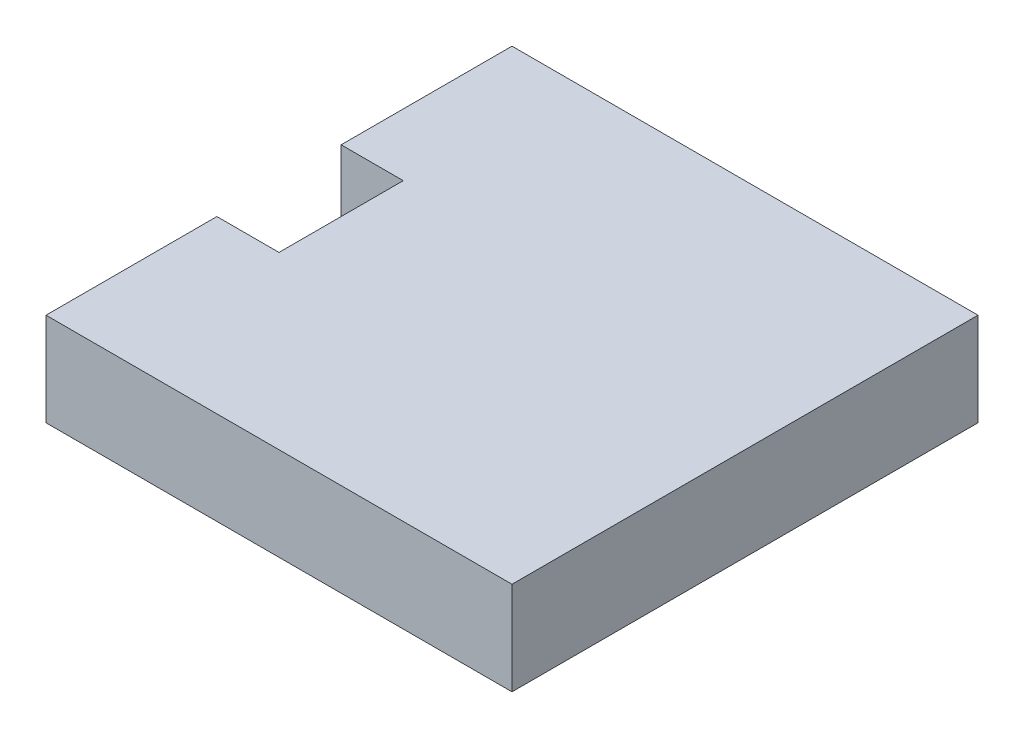
ISO-10303-21;
HEADER;
FILE_DESCRIPTION(('STEP AP214'),'2;1');
FILE_NAME('part.step','',(''),(''),'','','');
FILE_SCHEMA(('AUTOMOTIVE_DESIGN { 1 0 10303 214 1 1 1 1 }'));
ENDSEC;
DATA;
#1=APPLICATION_CONTEXT('core data for automotive mechanical design processes');
#2=APPLICATION_PROTOCOL_DEFINITION('international standard','automotive_design',2000,#1);
#3=PRODUCT_CONTEXT('',#1,'mechanical');
#4=PRODUCT('Part','Part','',(#3));
#5=PRODUCT_RELATED_PRODUCT_CATEGORY('part','',(#4));
#6=PRODUCT_DEFINITION_FORMATION('','',#4);
#7=PRODUCT_DEFINITION_CONTEXT('part definition',#1,'design');
#8=PRODUCT_DEFINITION('design','',#6,#7);
#9=PRODUCT_DEFINITION_SHAPE('','',#8);
#10=(LENGTH_UNIT() NAMED_UNIT(*) SI_UNIT(.MILLI.,.METRE.));
#11=(NAMED_UNIT(*) PLANE_ANGLE_UNIT() SI_UNIT($,.RADIAN.));
#12=(NAMED_UNIT(*) SI_UNIT($,.STERADIAN.) SOLID_ANGLE_UNIT());
#13=UNCERTAINTY_MEASURE_WITH_UNIT(LENGTH_MEASURE(1.E-05),#10,'distance_accuracy_value','');
#14=(GEOMETRIC_REPRESENTATION_CONTEXT(3) GLOBAL_UNCERTAINTY_ASSIGNED_CONTEXT((#13)) GLOBAL_UNIT_ASSIGNED_CONTEXT((#10,
#11,#12)) REPRESENTATION_CONTEXT('',''));
#15=CARTESIAN_POINT('',(0.,0.,0.));
#16=DIRECTION('',(0.,0.,1.));
#17=DIRECTION('',(1.,0.,0.));
#18=AXIS2_PLACEMENT_3D('',#15,#16,#17);
#19=CARTESIAN_POINT('',(0.,0.3,-1.49999999999998));
#20=DIRECTION('',(-1.,0.,0.));
#21=DIRECTION('',(0.,0.,1.));
#22=AXIS2_PLACEMENT_3D('',#19,#20,#21);
#23=PLANE('',#22);
#24=DIRECTION('',(0.,0.,-1.));
#25=VECTOR('',#24,1.);
#26=CARTESIAN_POINT('',(0.,0.,-1.49999999999998));
#27=LINE('',#26,#25);
#28=CARTESIAN_POINT('',(0.,0.,0.));
#29=VERTEX_POINT('',#28);
#30=CARTESIAN_POINT('',(0.,0.,-1.49999999999998));
#31=VERTEX_POINT('',#30);
#32=EDGE_CURVE('E143',#29,#31,#27,.T.);
#33=ORIENTED_EDGE('',*,*,#32,.T.);
#34=DIRECTION('',(0.,-1.,0.));
#35=VECTOR('',#34,1.);
#36=CARTESIAN_POINT('',(0.,0.3,-1.49999999999998));
#37=LINE('',#36,#35);
#38=CARTESIAN_POINT('',(0.,0.3,-1.49999999999998));
#39=VERTEX_POINT('',#38);
#40=EDGE_CURVE('E11',#39,#31,#37,.T.);
#41=ORIENTED_EDGE('',*,*,#40,.F.);
#42=DIRECTION('',(0.,0.,-1.));
#43=VECTOR('',#42,1.);
#44=CARTESIAN_POINT('',(0.,0.3,-1.49999999999998));
#45=LINE('',#44,#43);
#46=CARTESIAN_POINT('',(0.,0.3,0.));
#47=VERTEX_POINT('',#46);
#48=EDGE_CURVE('E162',#47,#39,#45,.T.);
#49=ORIENTED_EDGE('',*,*,#48,.F.);
#50=DIRECTION('',(0.,-1.,0.));
#51=VECTOR('',#50,1.);
#52=CARTESIAN_POINT('',(0.,0.3,0.));
#53=LINE('',#52,#51);
#54=EDGE_CURVE('E139',#47,#29,#53,.T.);
#55=ORIENTED_EDGE('',*,*,#54,.T.);
#56=EDGE_LOOP('',(#33,#41,#49,#55));
#57=FACE_BOUND('',#56,.T.);
#58=ADVANCED_FACE('F39',(#57),#23,.F.);
#59=CARTESIAN_POINT('',(0.,0.3,-1.49999999999998));
#60=DIRECTION('',(0.,0.,1.));
#61=DIRECTION('',(1.,0.,0.));
#62=AXIS2_PLACEMENT_3D('',#59,#60,#61);
#63=PLANE('',#62);
#64=DIRECTION('',(-1.,0.,0.));
#65=VECTOR('',#64,1.);
#66=CARTESIAN_POINT('',(0.,0.,-1.49999999999998));
#67=LINE('',#66,#65);
#68=CARTESIAN_POINT('',(-1.5,0.,-1.49999999999998));
#69=VERTEX_POINT('',#68);
#70=EDGE_CURVE('E147',#31,#69,#67,.T.);
#71=ORIENTED_EDGE('',*,*,#70,.T.);
#72=DIRECTION('',(0.,-1.,0.));
#73=VECTOR('',#72,1.);
#74=CARTESIAN_POINT('',(-1.5,0.3,-1.49999999999998));
#75=LINE('',#74,#73);
#76=CARTESIAN_POINT('',(-1.5,0.3,-1.49999999999998));
#77=VERTEX_POINT('',#76);
#78=EDGE_CURVE('E48',#77,#69,#75,.T.);
#79=ORIENTED_EDGE('',*,*,#78,.F.);
#80=DIRECTION('',(-1.,0.,0.));
#81=VECTOR('',#80,1.);
#82=CARTESIAN_POINT('',(0.,0.3,-1.49999999999998));
#83=LINE('',#82,#81);
#84=EDGE_CURVE('E105',#39,#77,#83,.T.);
#85=ORIENTED_EDGE('',*,*,#84,.F.);
#86=ORIENTED_EDGE('',*,*,#40,.T.);
#87=EDGE_LOOP('',(#71,#79,#85,#86));
#88=FACE_BOUND('',#87,.T.);
#89=ADVANCED_FACE('F203',(#88),#63,.F.);
#90=CARTESIAN_POINT('',(-1.5,0.3,-1.49999999999998));
#91=DIRECTION('',(1.,0.,0.));
#92=DIRECTION('',(0.,0.,-1.));
#93=AXIS2_PLACEMENT_3D('',#90,#91,#92);
#94=PLANE('',#93);
#95=DIRECTION('',(0.,0.,1.));
#96=VECTOR('',#95,1.);
#97=CARTESIAN_POINT('',(-1.5,0.,-1.49999999999998));
#98=LINE('',#97,#96);
#99=CARTESIAN_POINT('',(-1.5,0.,-0.949999999999992));
#100=VERTEX_POINT('',#99);
#101=EDGE_CURVE('E150',#69,#100,#98,.T.);
#102=ORIENTED_EDGE('',*,*,#101,.T.);
#103=DIRECTION('',(0.,-1.,0.));
#104=VECTOR('',#103,1.);
#105=CARTESIAN_POINT('',(-1.5,0.3,-0.949999999999992));
#106=LINE('',#105,#104);
#107=CARTESIAN_POINT('',(-1.5,0.3,-0.949999999999992));
#108=VERTEX_POINT('',#107);
#109=EDGE_CURVE('E171',#108,#100,#106,.T.);
#110=ORIENTED_EDGE('',*,*,#109,.F.);
#111=DIRECTION('',(0.,0.,1.));
#112=VECTOR('',#111,1.);
#113=CARTESIAN_POINT('',(-1.5,0.3,-1.49999999999998));
#114=LINE('',#113,#112);
#115=EDGE_CURVE('E179',#77,#108,#114,.T.);
#116=ORIENTED_EDGE('',*,*,#115,.F.);
#117=ORIENTED_EDGE('',*,*,#78,.T.);
#118=EDGE_LOOP('',(#102,#110,#116,#117));
#119=FACE_BOUND('',#118,.T.);
#120=ADVANCED_FACE('F177',(#119),#94,.F.);
#121=CARTESIAN_POINT('',(-1.5,0.3,-0.949999999999992));
#122=DIRECTION('',(0.,0.,-1.));
#123=DIRECTION('',(-1.,0.,0.));
#124=AXIS2_PLACEMENT_3D('',#121,#122,#123);
#125=PLANE('',#124);
#126=DIRECTION('',(1.,0.,0.));
#127=VECTOR('',#126,1.);
#128=CARTESIAN_POINT('',(-1.5,0.,-0.949999999999992));
#129=LINE('',#128,#127);
#130=CARTESIAN_POINT('',(-1.3,0.,-0.949999999999992));
#131=VERTEX_POINT('',#130);
#132=EDGE_CURVE('E152',#100,#131,#129,.T.);
#133=ORIENTED_EDGE('',*,*,#132,.T.);
#134=DIRECTION('',(0.,-1.,0.));
#135=VECTOR('',#134,1.);
#136=CARTESIAN_POINT('',(-1.3,0.3,-0.949999999999992));
#137=LINE('',#136,#135);
#138=CARTESIAN_POINT('',(-1.3,0.3,-0.949999999999992));
#139=VERTEX_POINT('',#138);
#140=EDGE_CURVE('E167',#139,#131,#137,.T.);
#141=ORIENTED_EDGE('',*,*,#140,.F.);
#142=DIRECTION('',(1.,0.,0.));
#143=VECTOR('',#142,1.);
#144=CARTESIAN_POINT('',(-1.5,0.3,-0.949999999999992));
#145=LINE('',#144,#143);
#146=EDGE_CURVE('E192',#108,#139,#145,.T.);
#147=ORIENTED_EDGE('',*,*,#146,.F.);
#148=ORIENTED_EDGE('',*,*,#109,.T.);
#149=EDGE_LOOP('',(#133,#141,#147,#148));
#150=FACE_BOUND('',#149,.T.);
#151=ADVANCED_FACE('F187',(#150),#125,.F.);
#152=CARTESIAN_POINT('',(-1.3,0.3,-0.949999999999992));
#153=DIRECTION('',(1.,0.,0.));
#154=DIRECTION('',(0.,0.,-1.));
#155=AXIS2_PLACEMENT_3D('',#152,#153,#154);
#156=PLANE('',#155);
#157=DIRECTION('',(0.,0.,1.));
#158=VECTOR('',#157,1.);
#159=CARTESIAN_POINT('',(-1.3,0.,-0.949999999999992));
#160=LINE('',#159,#158);
#161=CARTESIAN_POINT('',(-1.3,0.,-0.549999999999992));
#162=VERTEX_POINT('',#161);
#163=EDGE_CURVE('E155',#131,#162,#160,.T.);
#164=ORIENTED_EDGE('',*,*,#163,.T.);
#165=DIRECTION('',(0.,-1.,0.));
#166=VECTOR('',#165,1.);
#167=CARTESIAN_POINT('',(-1.3,0.3,-0.549999999999992));
#168=LINE('',#167,#166);
#169=CARTESIAN_POINT('',(-1.3,0.3,-0.549999999999992));
#170=VERTEX_POINT('',#169);
#171=EDGE_CURVE('E133',#170,#162,#168,.T.);
#172=ORIENTED_EDGE('',*,*,#171,.F.);
#173=DIRECTION('',(0.,0.,1.));
#174=VECTOR('',#173,1.);
#175=CARTESIAN_POINT('',(-1.3,0.3,-0.949999999999992));
#176=LINE('',#175,#174);
#177=EDGE_CURVE('E124',#139,#170,#176,.T.);
#178=ORIENTED_EDGE('',*,*,#177,.F.);
#179=ORIENTED_EDGE('',*,*,#140,.T.);
#180=EDGE_LOOP('',(#164,#172,#178,#179));
#181=FACE_BOUND('',#180,.T.);
#182=ADVANCED_FACE('F190',(#181),#156,.F.);
#183=CARTESIAN_POINT('',(-1.3,0.3,-0.549999999999992));
#184=DIRECTION('',(0.,0.,1.));
#185=DIRECTION('',(1.,0.,0.));
#186=AXIS2_PLACEMENT_3D('',#183,#184,#185);
#187=PLANE('',#186);
#188=DIRECTION('',(-1.,0.,0.));
#189=VECTOR('',#188,1.);
#190=CARTESIAN_POINT('',(-1.3,0.,-0.549999999999992));
#191=LINE('',#190,#189);
#192=CARTESIAN_POINT('',(-1.5,0.,-0.549999999999992));
#193=VERTEX_POINT('',#192);
#194=EDGE_CURVE('E132',#162,#193,#191,.T.);
#195=ORIENTED_EDGE('',*,*,#194,.T.);
#196=DIRECTION('',(0.,-1.,0.));
#197=VECTOR('',#196,1.);
#198=CARTESIAN_POINT('',(-1.5,0.3,-0.549999999999992));
#199=LINE('',#198,#197);
#200=CARTESIAN_POINT('',(-1.5,0.3,-0.549999999999992));
#201=VERTEX_POINT('',#200);
#202=EDGE_CURVE('E129',#201,#193,#199,.T.);
#203=ORIENTED_EDGE('',*,*,#202,.F.);
#204=DIRECTION('',(-1.,0.,0.));
#205=VECTOR('',#204,1.);
#206=CARTESIAN_POINT('',(-1.3,0.3,-0.549999999999992));
#207=LINE('',#206,#205);
#208=EDGE_CURVE('E118',#170,#201,#207,.T.);
#209=ORIENTED_EDGE('',*,*,#208,.F.);
#210=ORIENTED_EDGE('',*,*,#171,.T.);
#211=EDGE_LOOP('',(#195,#203,#209,#210));
#212=FACE_BOUND('',#211,.T.);
#213=ADVANCED_FACE('F130',(#212),#187,.F.);
#214=CARTESIAN_POINT('',(-1.5,0.3,-0.549999999999992));
#215=DIRECTION('',(1.,0.,0.));
#216=DIRECTION('',(0.,0.,-1.));
#217=AXIS2_PLACEMENT_3D('',#214,#215,#216);
#218=PLANE('',#217);
#219=DIRECTION('',(0.,0.,1.));
#220=VECTOR('',#219,1.);
#221=CARTESIAN_POINT('',(-1.5,0.,-0.549999999999992));
#222=LINE('',#221,#220);
#223=CARTESIAN_POINT('',(-1.5,0.,0.));
#224=VERTEX_POINT('',#223);
#225=EDGE_CURVE('E89',#193,#224,#222,.T.);
#226=ORIENTED_EDGE('',*,*,#225,.T.);
#227=DIRECTION('',(0.,-1.,0.));
#228=VECTOR('',#227,1.);
#229=CARTESIAN_POINT('',(-1.5,0.3,0.));
#230=LINE('',#229,#228);
#231=CARTESIAN_POINT('',(-1.5,0.3,0.));
#232=VERTEX_POINT('',#231);
#233=EDGE_CURVE('E134',#232,#224,#230,.T.);
#234=ORIENTED_EDGE('',*,*,#233,.F.);
#235=DIRECTION('',(0.,0.,1.));
#236=VECTOR('',#235,1.);
#237=CARTESIAN_POINT('',(-1.5,0.3,-0.549999999999992));
#238=LINE('',#237,#236);
#239=EDGE_CURVE('E122',#201,#232,#238,.T.);
#240=ORIENTED_EDGE('',*,*,#239,.F.);
#241=ORIENTED_EDGE('',*,*,#202,.T.);
#242=EDGE_LOOP('',(#226,#234,#240,#241));
#243=FACE_BOUND('',#242,.T.);
#244=ADVANCED_FACE('F136',(#243),#218,.F.);
#245=CARTESIAN_POINT('',(-1.5,0.3,0.));
#246=DIRECTION('',(0.,0.,-1.));
#247=DIRECTION('',(-1.,0.,0.));
#248=AXIS2_PLACEMENT_3D('',#245,#246,#247);
#249=PLANE('',#248);
#250=DIRECTION('',(1.,0.,0.));
#251=VECTOR('',#250,1.);
#252=CARTESIAN_POINT('',(-1.5,0.,0.));
#253=LINE('',#252,#251);
#254=EDGE_CURVE('E96',#224,#29,#253,.T.);
#255=ORIENTED_EDGE('',*,*,#254,.T.);
#256=ORIENTED_EDGE('',*,*,#54,.F.);
#257=DIRECTION('',(1.,0.,0.));
#258=VECTOR('',#257,1.);
#259=CARTESIAN_POINT('',(-1.5,0.3,0.));
#260=LINE('',#259,#258);
#261=EDGE_CURVE('E58',#232,#47,#260,.T.);
#262=ORIENTED_EDGE('',*,*,#261,.F.);
#263=ORIENTED_EDGE('',*,*,#233,.T.);
#264=EDGE_LOOP('',(#255,#256,#262,#263));
#265=FACE_BOUND('',#264,.T.);
#266=ADVANCED_FACE('F219',(#265),#249,.F.);
#267=CARTESIAN_POINT('',(0.,0.3,0.));
#268=DIRECTION('',(0.,1.,0.));
#269=DIRECTION('',(0.,0.,1.));
#270=AXIS2_PLACEMENT_3D('',#267,#268,#269);
#271=PLANE('',#270);
#272=ORIENTED_EDGE('',*,*,#48,.T.);
#273=ORIENTED_EDGE('',*,*,#84,.T.);
#274=ORIENTED_EDGE('',*,*,#115,.T.);
#275=ORIENTED_EDGE('',*,*,#146,.T.);
#276=ORIENTED_EDGE('',*,*,#177,.T.);
#277=ORIENTED_EDGE('',*,*,#208,.T.);
#278=ORIENTED_EDGE('',*,*,#239,.T.);
#279=ORIENTED_EDGE('',*,*,#261,.T.);
#280=EDGE_LOOP('',(#272,#273,#274,#275,#276,#277,#278,#279));
#281=FACE_BOUND('',#280,.T.);
#282=ADVANCED_FACE('F120',(#281),#271,.T.);
#283=CARTESIAN_POINT('',(0.,0.,0.));
#284=DIRECTION('',(0.,1.,0.));
#285=DIRECTION('',(0.,0.,1.));
#286=AXIS2_PLACEMENT_3D('',#283,#284,#285);
#287=PLANE('',#286);
#288=ORIENTED_EDGE('',*,*,#32,.F.);
#289=ORIENTED_EDGE('',*,*,#254,.F.);
#290=ORIENTED_EDGE('',*,*,#225,.F.);
#291=ORIENTED_EDGE('',*,*,#194,.F.);
#292=ORIENTED_EDGE('',*,*,#163,.F.);
#293=ORIENTED_EDGE('',*,*,#132,.F.);
#294=ORIENTED_EDGE('',*,*,#101,.F.);
#295=ORIENTED_EDGE('',*,*,#70,.F.);
#296=EDGE_LOOP('',(#288,#289,#290,#291,#292,#293,#294,#295));
#297=FACE_BOUND('',#296,.T.);
#298=ADVANCED_FACE('F183',(#297),#287,.F.);
#299=CLOSED_SHELL('',(#58,#89,#120,#151,#182,#213,#244,#266,#282,#298));
#300=MANIFOLD_SOLID_BREP('B2',#299);
#301=ADVANCED_BREP_SHAPE_REPRESENTATION('',(#18,#300),#14);
#302=SHAPE_DEFINITION_REPRESENTATION(#9,#301);
ENDSEC;
END-ISO-10303-21;
